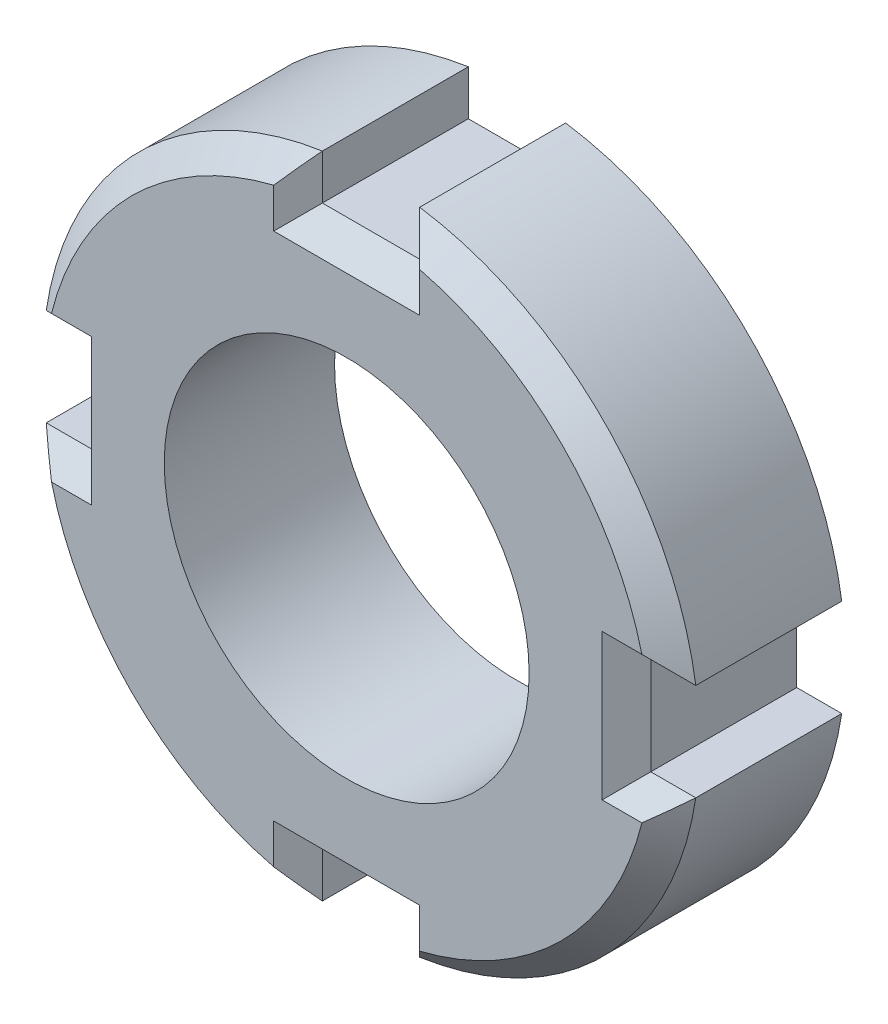
ISO-10303-21;
HEADER;
FILE_DESCRIPTION(('STEP AP214'),'2;1');
FILE_NAME('part.step','',(''),(''),'','','');
FILE_SCHEMA(('AUTOMOTIVE_DESIGN { 1 0 10303 214 1 1 1 1 }'));
ENDSEC;
DATA;
#1=APPLICATION_CONTEXT('core data for automotive mechanical design processes');
#2=APPLICATION_PROTOCOL_DEFINITION('international standard','automotive_design',2000,#1);
#3=PRODUCT_CONTEXT('',#1,'mechanical');
#4=PRODUCT('Part','Part','',(#3));
#5=PRODUCT_RELATED_PRODUCT_CATEGORY('part','',(#4));
#6=PRODUCT_DEFINITION_FORMATION('','',#4);
#7=PRODUCT_DEFINITION_CONTEXT('part definition',#1,'design');
#8=PRODUCT_DEFINITION('design','',#6,#7);
#9=PRODUCT_DEFINITION_SHAPE('','',#8);
#10=(LENGTH_UNIT() NAMED_UNIT(*) SI_UNIT(.MILLI.,.METRE.));
#11=(NAMED_UNIT(*) PLANE_ANGLE_UNIT() SI_UNIT($,.RADIAN.));
#12=(NAMED_UNIT(*) SI_UNIT($,.STERADIAN.) SOLID_ANGLE_UNIT());
#13=UNCERTAINTY_MEASURE_WITH_UNIT(LENGTH_MEASURE(1.E-05),#10,'distance_accuracy_value','');
#14=(GEOMETRIC_REPRESENTATION_CONTEXT(3) GLOBAL_UNCERTAINTY_ASSIGNED_CONTEXT((#13)) GLOBAL_UNIT_ASSIGNED_CONTEXT((#10,
#11,#12)) REPRESENTATION_CONTEXT('',''));
#15=CARTESIAN_POINT('',(0.,0.,0.));
#16=DIRECTION('',(0.,0.,1.));
#17=DIRECTION('',(1.,0.,0.));
#18=AXIS2_PLACEMENT_3D('',#15,#16,#17);
#19=CARTESIAN_POINT('',(0.,2.,7.));
#20=DIRECTION('',(0.,1.,0.));
#21=DIRECTION('',(-1.,0.,0.));
#22=AXIS2_PLACEMENT_3D('',#19,#20,#21);
#23=PLANE('',#22);
#24=DIRECTION('',(0.,0.,-1.));
#25=VECTOR('',#24,1.);
#26=CARTESIAN_POINT('',(13.3510299228187,1.99999999999995,7.));
#27=LINE('',#26,#25);
#28=CARTESIAN_POINT('',(13.3510299228187,1.99999999999995,6.));
#29=VERTEX_POINT('',#28);
#30=CARTESIAN_POINT('',(13.3510299228187,1.99999999999995,0.));
#31=VERTEX_POINT('',#30);
#32=EDGE_CURVE('E202',#29,#31,#27,.T.);
#33=ORIENTED_EDGE('',*,*,#32,.F.);
#34=DIRECTION('',(-1.,0.,0.));
#35=VECTOR('',#34,1.);
#36=CARTESIAN_POINT('',(11.5,1.99999999999996,6.));
#37=LINE('',#36,#35);
#38=CARTESIAN_POINT('',(11.5,1.99999999999996,6.));
#39=VERTEX_POINT('',#38);
#40=EDGE_CURVE('E11',#29,#39,#37,.T.);
#41=ORIENTED_EDGE('',*,*,#40,.T.);
#42=DIRECTION('',(0.,0.,-1.));
#43=VECTOR('',#42,1.);
#44=CARTESIAN_POINT('',(11.5,1.99999999999996,7.));
#45=LINE('',#44,#43);
#46=CARTESIAN_POINT('',(11.5,1.99999999999996,0.));
#47=VERTEX_POINT('',#46);
#48=EDGE_CURVE('E226',#39,#47,#45,.T.);
#49=ORIENTED_EDGE('',*,*,#48,.T.);
#50=DIRECTION('',(1.,0.,0.));
#51=VECTOR('',#50,1.);
#52=CARTESIAN_POINT('',(0.,2.,0.));
#53=LINE('',#52,#51);
#54=EDGE_CURVE('E217',#47,#31,#53,.T.);
#55=ORIENTED_EDGE('',*,*,#54,.T.);
#56=EDGE_LOOP('',(#33,#41,#49,#55));
#57=FACE_BOUND('',#56,.T.);
#58=ADVANCED_FACE('F41',(#57),#23,.F.);
#59=CARTESIAN_POINT('',(0.,0.,7.));
#60=DIRECTION('',(0.,0.,-1.));
#61=DIRECTION('',(-1.,0.,0.));
#62=AXIS2_PLACEMENT_3D('',#59,#60,#61);
#63=CYLINDRICAL_SURFACE('',#62,13.5);
#64=DIRECTION('',(0.,0.,-1.));
#65=VECTOR('',#64,1.);
#66=CARTESIAN_POINT('',(2.,13.3510299228187,7.));
#67=LINE('',#66,#65);
#68=CARTESIAN_POINT('',(2.,13.3510299228187,6.));
#69=VERTEX_POINT('',#68);
#70=CARTESIAN_POINT('',(2.,13.3510299228187,0.));
#71=VERTEX_POINT('',#70);
#72=EDGE_CURVE('E211',#69,#71,#67,.T.);
#73=ORIENTED_EDGE('',*,*,#72,.F.);
#74=CARTESIAN_POINT('',(0.,0.,6.));
#75=DIRECTION('',(0.,0.,1.));
#76=DIRECTION('',(1.,0.,0.));
#77=AXIS2_PLACEMENT_3D('',#74,#75,#76);
#78=CIRCLE('',#77,13.5);
#79=EDGE_CURVE('E51',#69,#29,#78,.F.);
#80=ORIENTED_EDGE('',*,*,#79,.T.);
#81=ORIENTED_EDGE('',*,*,#32,.T.);
#82=CARTESIAN_POINT('',(0.,0.,0.));
#83=DIRECTION('',(0.,0.,1.));
#84=DIRECTION('',(1.,0.,0.));
#85=AXIS2_PLACEMENT_3D('',#82,#83,#84);
#86=CIRCLE('',#85,13.5);
#87=EDGE_CURVE('E205',#31,#71,#86,.T.);
#88=ORIENTED_EDGE('',*,*,#87,.T.);
#89=EDGE_LOOP('',(#73,#80,#81,#88));
#90=FACE_BOUND('',#89,.T.);
#91=ADVANCED_FACE('F204',(#90),#63,.T.);
#92=CARTESIAN_POINT('',(2.,0.,7.));
#93=DIRECTION('',(-1.,0.,0.));
#94=DIRECTION('',(0.,0.,1.));
#95=AXIS2_PLACEMENT_3D('',#92,#93,#94);
#96=PLANE('',#95);
#97=DIRECTION('',(0.,0.,-1.));
#98=VECTOR('',#97,1.);
#99=CARTESIAN_POINT('',(2.,11.5,7.));
#100=LINE('',#99,#98);
#101=CARTESIAN_POINT('',(2.,11.5,6.));
#102=VERTEX_POINT('',#101);
#103=CARTESIAN_POINT('',(2.,11.5,0.));
#104=VERTEX_POINT('',#103);
#105=EDGE_CURVE('E289',#102,#104,#100,.T.);
#106=ORIENTED_EDGE('',*,*,#105,.F.);
#107=DIRECTION('',(0.,1.,0.));
#108=VECTOR('',#107,1.);
#109=CARTESIAN_POINT('',(2.,0.,6.));
#110=LINE('',#109,#108);
#111=EDGE_CURVE('E66',#102,#69,#110,.T.);
#112=ORIENTED_EDGE('',*,*,#111,.T.);
#113=ORIENTED_EDGE('',*,*,#72,.T.);
#114=DIRECTION('',(0.,1.,0.));
#115=VECTOR('',#114,1.);
#116=CARTESIAN_POINT('',(2.,0.,0.));
#117=LINE('',#116,#115);
#118=EDGE_CURVE('E221',#104,#71,#117,.T.);
#119=ORIENTED_EDGE('',*,*,#118,.F.);
#120=EDGE_LOOP('',(#106,#112,#113,#119));
#121=FACE_BOUND('',#120,.T.);
#122=ADVANCED_FACE('F512',(#121),#96,.T.);
#123=CARTESIAN_POINT('',(0.,11.5,7.));
#124=DIRECTION('',(0.,1.,0.));
#125=DIRECTION('',(0.,0.,1.));
#126=AXIS2_PLACEMENT_3D('',#123,#124,#125);
#127=PLANE('',#126);
#128=DIRECTION('',(0.,0.,-1.));
#129=VECTOR('',#128,1.);
#130=CARTESIAN_POINT('',(-2.,11.5,7.));
#131=LINE('',#130,#129);
#132=CARTESIAN_POINT('',(-2.,11.5,6.));
#133=VERTEX_POINT('',#132);
#134=CARTESIAN_POINT('',(-2.,11.5,0.));
#135=VERTEX_POINT('',#134);
#136=EDGE_CURVE('E287',#133,#135,#131,.T.);
#137=ORIENTED_EDGE('',*,*,#136,.F.);
#138=DIRECTION('',(1.,0.,0.));
#139=VECTOR('',#138,1.);
#140=CARTESIAN_POINT('',(0.,11.5,6.));
#141=LINE('',#140,#139);
#142=EDGE_CURVE('E349',#133,#102,#141,.T.);
#143=ORIENTED_EDGE('',*,*,#142,.T.);
#144=ORIENTED_EDGE('',*,*,#105,.T.);
#145=DIRECTION('',(1.,0.,0.));
#146=VECTOR('',#145,1.);
#147=CARTESIAN_POINT('',(0.,11.5,0.));
#148=LINE('',#147,#146);
#149=EDGE_CURVE('E234',#135,#104,#148,.T.);
#150=ORIENTED_EDGE('',*,*,#149,.F.);
#151=EDGE_LOOP('',(#137,#143,#144,#150));
#152=FACE_BOUND('',#151,.T.);
#153=ADVANCED_FACE('F589',(#152),#127,.T.);
#154=CARTESIAN_POINT('',(-2.,0.,7.));
#155=DIRECTION('',(-1.,0.,0.));
#156=DIRECTION('',(0.,0.,1.));
#157=AXIS2_PLACEMENT_3D('',#154,#155,#156);
#158=PLANE('',#157);
#159=DIRECTION('',(0.,0.,-1.));
#160=VECTOR('',#159,1.);
#161=CARTESIAN_POINT('',(-2.,13.3510299228187,7.));
#162=LINE('',#161,#160);
#163=CARTESIAN_POINT('',(-2.,13.3510299228187,6.));
#164=VERTEX_POINT('',#163);
#165=CARTESIAN_POINT('',(-2.,13.3510299228187,0.));
#166=VERTEX_POINT('',#165);
#167=EDGE_CURVE('E285',#164,#166,#162,.T.);
#168=ORIENTED_EDGE('',*,*,#167,.F.);
#169=DIRECTION('',(0.,-1.,0.));
#170=VECTOR('',#169,1.);
#171=CARTESIAN_POINT('',(-2.,11.5,6.));
#172=LINE('',#171,#170);
#173=EDGE_CURVE('E347',#164,#133,#172,.T.);
#174=ORIENTED_EDGE('',*,*,#173,.T.);
#175=ORIENTED_EDGE('',*,*,#136,.T.);
#176=DIRECTION('',(0.,1.,0.));
#177=VECTOR('',#176,1.);
#178=CARTESIAN_POINT('',(-2.,0.,0.));
#179=LINE('',#178,#177);
#180=EDGE_CURVE('E236',#135,#166,#179,.T.);
#181=ORIENTED_EDGE('',*,*,#180,.T.);
#182=EDGE_LOOP('',(#168,#174,#175,#181));
#183=FACE_BOUND('',#182,.T.);
#184=ADVANCED_FACE('F585',(#183),#158,.F.);
#185=DIRECTION('',(0.,0.,-1.));
#186=VECTOR('',#185,1.);
#187=CARTESIAN_POINT('',(-13.3510299228187,2.00000000000014,7.));
#188=LINE('',#187,#186);
#189=CARTESIAN_POINT('',(-13.3510299228187,2.00000000000014,6.));
#190=VERTEX_POINT('',#189);
#191=CARTESIAN_POINT('',(-13.3510299228187,2.00000000000014,0.));
#192=VERTEX_POINT('',#191);
#193=EDGE_CURVE('E283',#190,#192,#188,.T.);
#194=ORIENTED_EDGE('',*,*,#193,.F.);
#195=CARTESIAN_POINT('',(0.,0.,6.));
#196=DIRECTION('',(0.,0.,1.));
#197=DIRECTION('',(1.,0.,0.));
#198=AXIS2_PLACEMENT_3D('',#195,#196,#197);
#199=CIRCLE('',#198,13.5);
#200=EDGE_CURVE('E345',#190,#164,#199,.F.);
#201=ORIENTED_EDGE('',*,*,#200,.T.);
#202=ORIENTED_EDGE('',*,*,#167,.T.);
#203=EDGE_CURVE('E224',#166,#192,#86,.T.);
#204=ORIENTED_EDGE('',*,*,#203,.T.);
#205=EDGE_LOOP('',(#194,#201,#202,#204));
#206=FACE_BOUND('',#205,.T.);
#207=ADVANCED_FACE('F514',(#206),#63,.T.);
#208=CARTESIAN_POINT('',(0.,2.,7.));
#209=DIRECTION('',(0.,-1.,0.));
#210=DIRECTION('',(1.,0.,0.));
#211=AXIS2_PLACEMENT_3D('',#208,#209,#210);
#212=PLANE('',#211);
#213=DIRECTION('',(0.,0.,-1.));
#214=VECTOR('',#213,1.);
#215=CARTESIAN_POINT('',(-11.5,2.00000000000012,7.));
#216=LINE('',#215,#214);
#217=CARTESIAN_POINT('',(-11.5,2.00000000000012,6.));
#218=VERTEX_POINT('',#217);
#219=CARTESIAN_POINT('',(-11.5,2.00000000000012,0.));
#220=VERTEX_POINT('',#219);
#221=EDGE_CURVE('E281',#218,#220,#216,.T.);
#222=ORIENTED_EDGE('',*,*,#221,.F.);
#223=DIRECTION('',(-1.,0.,0.));
#224=VECTOR('',#223,1.);
#225=CARTESIAN_POINT('',(0.,2.,6.));
#226=LINE('',#225,#224);
#227=EDGE_CURVE('E343',#218,#190,#226,.T.);
#228=ORIENTED_EDGE('',*,*,#227,.T.);
#229=ORIENTED_EDGE('',*,*,#193,.T.);
#230=DIRECTION('',(-1.,0.,0.));
#231=VECTOR('',#230,1.);
#232=CARTESIAN_POINT('',(0.,2.,0.));
#233=LINE('',#232,#231);
#234=EDGE_CURVE('E239',#220,#192,#233,.T.);
#235=ORIENTED_EDGE('',*,*,#234,.F.);
#236=EDGE_LOOP('',(#222,#228,#229,#235));
#237=FACE_BOUND('',#236,.T.);
#238=ADVANCED_FACE('F572',(#237),#212,.T.);
#239=CARTESIAN_POINT('',(-11.5,1.196959198424E-13,7.));
#240=DIRECTION('',(-1.,0.,0.));
#241=DIRECTION('',(0.,-1.,0.));
#242=AXIS2_PLACEMENT_3D('',#239,#240,#241);
#243=PLANE('',#242);
#244=DIRECTION('',(0.,0.,-1.));
#245=VECTOR('',#244,1.);
#246=CARTESIAN_POINT('',(-11.5,-1.99999999999988,7.));
#247=LINE('',#246,#245);
#248=CARTESIAN_POINT('',(-11.5,-1.99999999999988,6.));
#249=VERTEX_POINT('',#248);
#250=CARTESIAN_POINT('',(-11.5,-1.99999999999988,0.));
#251=VERTEX_POINT('',#250);
#252=EDGE_CURVE('E279',#249,#251,#247,.T.);
#253=ORIENTED_EDGE('',*,*,#252,.F.);
#254=DIRECTION('',(0.,1.,0.));
#255=VECTOR('',#254,1.);
#256=CARTESIAN_POINT('',(-11.5,1.196959198424E-13,6.));
#257=LINE('',#256,#255);
#258=EDGE_CURVE('E341',#249,#218,#257,.T.);
#259=ORIENTED_EDGE('',*,*,#258,.T.);
#260=ORIENTED_EDGE('',*,*,#221,.T.);
#261=DIRECTION('',(0.,1.,0.));
#262=VECTOR('',#261,1.);
#263=CARTESIAN_POINT('',(-11.5,1.196959198424E-13,0.));
#264=LINE('',#263,#262);
#265=EDGE_CURVE('E242',#251,#220,#264,.T.);
#266=ORIENTED_EDGE('',*,*,#265,.F.);
#267=EDGE_LOOP('',(#253,#259,#260,#266));
#268=FACE_BOUND('',#267,.T.);
#269=ADVANCED_FACE('F644',(#268),#243,.T.);
#270=CARTESIAN_POINT('',(0.,-2.,7.));
#271=DIRECTION('',(0.,-1.,0.));
#272=DIRECTION('',(1.,0.,0.));
#273=AXIS2_PLACEMENT_3D('',#270,#271,#272);
#274=PLANE('',#273);
#275=DIRECTION('',(0.,0.,-1.));
#276=VECTOR('',#275,1.);
#277=CARTESIAN_POINT('',(-13.3510299228187,-1.99999999999986,7.));
#278=LINE('',#277,#276);
#279=CARTESIAN_POINT('',(-13.3510299228187,-1.99999999999986,6.));
#280=VERTEX_POINT('',#279);
#281=CARTESIAN_POINT('',(-13.3510299228187,-1.99999999999986,0.));
#282=VERTEX_POINT('',#281);
#283=EDGE_CURVE('E277',#280,#282,#278,.T.);
#284=ORIENTED_EDGE('',*,*,#283,.F.);
#285=DIRECTION('',(1.,0.,0.));
#286=VECTOR('',#285,1.);
#287=CARTESIAN_POINT('',(-11.5,-1.99999999999988,6.));
#288=LINE('',#287,#286);
#289=EDGE_CURVE('E339',#280,#249,#288,.T.);
#290=ORIENTED_EDGE('',*,*,#289,.T.);
#291=ORIENTED_EDGE('',*,*,#252,.T.);
#292=DIRECTION('',(-1.,0.,0.));
#293=VECTOR('',#292,1.);
#294=CARTESIAN_POINT('',(0.,-2.,0.));
#295=LINE('',#294,#293);
#296=EDGE_CURVE('E245',#251,#282,#295,.T.);
#297=ORIENTED_EDGE('',*,*,#296,.T.);
#298=EDGE_LOOP('',(#284,#290,#291,#297));
#299=FACE_BOUND('',#298,.T.);
#300=ADVANCED_FACE('F636',(#299),#274,.F.);
#301=DIRECTION('',(0.,0.,-1.));
#302=VECTOR('',#301,1.);
#303=CARTESIAN_POINT('',(-2.00000000000009,-13.3510299228187,7.));
#304=LINE('',#303,#302);
#305=CARTESIAN_POINT('',(-2.00000000000009,-13.3510299228187,6.));
#306=VERTEX_POINT('',#305);
#307=CARTESIAN_POINT('',(-2.00000000000009,-13.3510299228187,0.));
#308=VERTEX_POINT('',#307);
#309=EDGE_CURVE('E275',#306,#308,#304,.T.);
#310=ORIENTED_EDGE('',*,*,#309,.F.);
#311=CARTESIAN_POINT('',(0.,0.,6.));
#312=DIRECTION('',(0.,0.,1.));
#313=DIRECTION('',(1.,0.,0.));
#314=AXIS2_PLACEMENT_3D('',#311,#312,#313);
#315=CIRCLE('',#314,13.5);
#316=EDGE_CURVE('E337',#306,#280,#315,.F.);
#317=ORIENTED_EDGE('',*,*,#316,.T.);
#318=ORIENTED_EDGE('',*,*,#283,.T.);
#319=EDGE_CURVE('E248',#282,#308,#86,.T.);
#320=ORIENTED_EDGE('',*,*,#319,.T.);
#321=EDGE_LOOP('',(#310,#317,#318,#320));
#322=FACE_BOUND('',#321,.T.);
#323=ADVANCED_FACE('F633',(#322),#63,.T.);
#324=CARTESIAN_POINT('',(-2.,0.,7.));
#325=DIRECTION('',(1.,0.,0.));
#326=DIRECTION('',(0.,1.,0.));
#327=AXIS2_PLACEMENT_3D('',#324,#325,#326);
#328=PLANE('',#327);
#329=DIRECTION('',(0.,0.,-1.));
#330=VECTOR('',#329,1.);
#331=CARTESIAN_POINT('',(-2.00000000000008,-11.5,7.));
#332=LINE('',#331,#330);
#333=CARTESIAN_POINT('',(-2.00000000000008,-11.5,6.));
#334=VERTEX_POINT('',#333);
#335=CARTESIAN_POINT('',(-2.00000000000008,-11.5,0.));
#336=VERTEX_POINT('',#335);
#337=EDGE_CURVE('E273',#334,#336,#332,.T.);
#338=ORIENTED_EDGE('',*,*,#337,.F.);
#339=DIRECTION('',(0.,-1.,0.));
#340=VECTOR('',#339,1.);
#341=CARTESIAN_POINT('',(-2.,0.,6.));
#342=LINE('',#341,#340);
#343=EDGE_CURVE('E335',#334,#306,#342,.T.);
#344=ORIENTED_EDGE('',*,*,#343,.T.);
#345=ORIENTED_EDGE('',*,*,#309,.T.);
#346=DIRECTION('',(0.,-1.,0.));
#347=VECTOR('',#346,1.);
#348=CARTESIAN_POINT('',(-2.,0.,0.));
#349=LINE('',#348,#347);
#350=EDGE_CURVE('E249',#336,#308,#349,.T.);
#351=ORIENTED_EDGE('',*,*,#350,.F.);
#352=EDGE_LOOP('',(#338,#344,#345,#351));
#353=FACE_BOUND('',#352,.T.);
#354=ADVANCED_FACE('F647',(#353),#328,.T.);
#355=CARTESIAN_POINT('',(0.,-11.5,7.));
#356=DIRECTION('',(0.,-1.,0.));
#357=DIRECTION('',(1.,0.,0.));
#358=AXIS2_PLACEMENT_3D('',#355,#356,#357);
#359=PLANE('',#358);
#360=DIRECTION('',(0.,0.,-1.));
#361=VECTOR('',#360,1.);
#362=CARTESIAN_POINT('',(1.99999999999992,-11.5,7.));
#363=LINE('',#362,#361);
#364=CARTESIAN_POINT('',(1.99999999999992,-11.5,6.));
#365=VERTEX_POINT('',#364);
#366=CARTESIAN_POINT('',(1.99999999999992,-11.5,0.));
#367=VERTEX_POINT('',#366);
#368=EDGE_CURVE('E271',#365,#367,#363,.T.);
#369=ORIENTED_EDGE('',*,*,#368,.F.);
#370=DIRECTION('',(-1.,0.,0.));
#371=VECTOR('',#370,1.);
#372=CARTESIAN_POINT('',(0.,-11.5,6.));
#373=LINE('',#372,#371);
#374=EDGE_CURVE('E333',#365,#334,#373,.T.);
#375=ORIENTED_EDGE('',*,*,#374,.T.);
#376=ORIENTED_EDGE('',*,*,#337,.T.);
#377=DIRECTION('',(-1.,0.,0.));
#378=VECTOR('',#377,1.);
#379=CARTESIAN_POINT('',(0.,-11.5,0.));
#380=LINE('',#379,#378);
#381=EDGE_CURVE('E252',#367,#336,#380,.T.);
#382=ORIENTED_EDGE('',*,*,#381,.F.);
#383=EDGE_LOOP('',(#369,#375,#376,#382));
#384=FACE_BOUND('',#383,.T.);
#385=ADVANCED_FACE('F611',(#384),#359,.T.);
#386=CARTESIAN_POINT('',(2.,0.,7.));
#387=DIRECTION('',(1.,0.,0.));
#388=DIRECTION('',(0.,1.,0.));
#389=AXIS2_PLACEMENT_3D('',#386,#387,#388);
#390=PLANE('',#389);
#391=DIRECTION('',(0.,0.,-1.));
#392=VECTOR('',#391,1.);
#393=CARTESIAN_POINT('',(1.99999999999991,-13.3510299228187,7.));
#394=LINE('',#393,#392);
#395=CARTESIAN_POINT('',(1.99999999999991,-13.3510299228187,6.));
#396=VERTEX_POINT('',#395);
#397=CARTESIAN_POINT('',(1.99999999999991,-13.3510299228187,0.));
#398=VERTEX_POINT('',#397);
#399=EDGE_CURVE('E269',#396,#398,#394,.T.);
#400=ORIENTED_EDGE('',*,*,#399,.F.);
#401=DIRECTION('',(0.,1.,0.));
#402=VECTOR('',#401,1.);
#403=CARTESIAN_POINT('',(1.99999999999992,-11.5,6.));
#404=LINE('',#403,#402);
#405=EDGE_CURVE('E331',#396,#365,#404,.T.);
#406=ORIENTED_EDGE('',*,*,#405,.T.);
#407=ORIENTED_EDGE('',*,*,#368,.T.);
#408=DIRECTION('',(0.,-1.,0.));
#409=VECTOR('',#408,1.);
#410=CARTESIAN_POINT('',(2.,0.,0.));
#411=LINE('',#410,#409);
#412=EDGE_CURVE('E255',#367,#398,#411,.T.);
#413=ORIENTED_EDGE('',*,*,#412,.T.);
#414=EDGE_LOOP('',(#400,#406,#407,#413));
#415=FACE_BOUND('',#414,.T.);
#416=ADVANCED_FACE('F608',(#415),#390,.F.);
#417=DIRECTION('',(0.,0.,-1.));
#418=VECTOR('',#417,1.);
#419=CARTESIAN_POINT('',(13.3510299228187,-2.00000000000005,7.));
#420=LINE('',#419,#418);
#421=CARTESIAN_POINT('',(13.3510299228187,-2.00000000000005,6.));
#422=VERTEX_POINT('',#421);
#423=CARTESIAN_POINT('',(13.3510299228187,-2.00000000000005,0.));
#424=VERTEX_POINT('',#423);
#425=EDGE_CURVE('E267',#422,#424,#420,.T.);
#426=ORIENTED_EDGE('',*,*,#425,.F.);
#427=CARTESIAN_POINT('',(0.,0.,6.));
#428=DIRECTION('',(0.,0.,1.));
#429=DIRECTION('',(1.,0.,0.));
#430=AXIS2_PLACEMENT_3D('',#427,#428,#429);
#431=CIRCLE('',#430,13.5);
#432=EDGE_CURVE('E329',#422,#396,#431,.F.);
#433=ORIENTED_EDGE('',*,*,#432,.T.);
#434=ORIENTED_EDGE('',*,*,#399,.T.);
#435=EDGE_CURVE('E223',#398,#424,#86,.T.);
#436=ORIENTED_EDGE('',*,*,#435,.T.);
#437=EDGE_LOOP('',(#426,#433,#434,#436));
#438=FACE_BOUND('',#437,.T.);
#439=ADVANCED_FACE('F515',(#438),#63,.T.);
#440=CARTESIAN_POINT('',(0.,-2.,7.));
#441=DIRECTION('',(0.,1.,0.));
#442=DIRECTION('',(-1.,0.,0.));
#443=AXIS2_PLACEMENT_3D('',#440,#441,#442);
#444=PLANE('',#443);
#445=DIRECTION('',(0.,0.,-1.));
#446=VECTOR('',#445,1.);
#447=CARTESIAN_POINT('',(11.5,-2.00000000000004,7.));
#448=LINE('',#447,#446);
#449=CARTESIAN_POINT('',(11.5,-2.00000000000004,6.));
#450=VERTEX_POINT('',#449);
#451=CARTESIAN_POINT('',(11.5,-2.00000000000004,0.));
#452=VERTEX_POINT('',#451);
#453=EDGE_CURVE('E265',#450,#452,#448,.T.);
#454=ORIENTED_EDGE('',*,*,#453,.F.);
#455=DIRECTION('',(1.,0.,0.));
#456=VECTOR('',#455,1.);
#457=CARTESIAN_POINT('',(0.,-2.,6.));
#458=LINE('',#457,#456);
#459=EDGE_CURVE('E327',#450,#422,#458,.T.);
#460=ORIENTED_EDGE('',*,*,#459,.T.);
#461=ORIENTED_EDGE('',*,*,#425,.T.);
#462=DIRECTION('',(1.,0.,0.));
#463=VECTOR('',#462,1.);
#464=CARTESIAN_POINT('',(0.,-2.,0.));
#465=LINE('',#464,#463);
#466=EDGE_CURVE('E258',#452,#424,#465,.T.);
#467=ORIENTED_EDGE('',*,*,#466,.F.);
#468=EDGE_LOOP('',(#454,#460,#461,#467));
#469=FACE_BOUND('',#468,.T.);
#470=ADVANCED_FACE('F522',(#469),#444,.T.);
#471=CARTESIAN_POINT('',(0.,0.,7.));
#472=DIRECTION('',(0.,0.,-1.));
#473=DIRECTION('',(-1.,0.,0.));
#474=AXIS2_PLACEMENT_3D('',#471,#472,#473);
#475=CYLINDRICAL_SURFACE('',#474,7.5);
#476=CARTESIAN_POINT('',(0.,0.,7.));
#477=DIRECTION('',(0.,0.,1.));
#478=DIRECTION('',(1.,0.,0.));
#479=AXIS2_PLACEMENT_3D('',#476,#477,#478);
#480=CIRCLE('',#479,7.5);
#481=CARTESIAN_POINT('',(7.5,0.,7.));
#482=VERTEX_POINT('',#481);
#483=EDGE_CURVE('E263',#482,#482,#480,.T.);
#484=ORIENTED_EDGE('',*,*,#483,.T.);
#485=EDGE_LOOP('',(#484));
#486=FACE_BOUND('',#485,.T.);
#487=CARTESIAN_POINT('',(0.,0.,0.));
#488=DIRECTION('',(0.,0.,1.));
#489=DIRECTION('',(1.,0.,0.));
#490=AXIS2_PLACEMENT_3D('',#487,#488,#489);
#491=CIRCLE('',#490,7.5);
#492=CARTESIAN_POINT('',(7.5,0.,0.));
#493=VERTEX_POINT('',#492);
#494=EDGE_CURVE('E227',#493,#493,#491,.T.);
#495=ORIENTED_EDGE('',*,*,#494,.F.);
#496=EDGE_LOOP('',(#495));
#497=FACE_BOUND('',#496,.T.);
#498=ADVANCED_FACE('F519',(#486,#497),#475,.F.);
#499=CARTESIAN_POINT('',(11.5,0.,7.));
#500=DIRECTION('',(1.,0.,0.));
#501=DIRECTION('',(0.,1.,0.));
#502=AXIS2_PLACEMENT_3D('',#499,#500,#501);
#503=PLANE('',#502);
#504=ORIENTED_EDGE('',*,*,#48,.F.);
#505=DIRECTION('',(0.,-1.,0.));
#506=VECTOR('',#505,1.);
#507=CARTESIAN_POINT('',(11.5,0.,6.));
#508=LINE('',#507,#506);
#509=EDGE_CURVE('E210',#39,#450,#508,.T.);
#510=ORIENTED_EDGE('',*,*,#509,.T.);
#511=ORIENTED_EDGE('',*,*,#453,.T.);
#512=DIRECTION('',(0.,-1.,0.));
#513=VECTOR('',#512,1.);
#514=CARTESIAN_POINT('',(11.5,0.,0.));
#515=LINE('',#514,#513);
#516=EDGE_CURVE('E261',#47,#452,#515,.T.);
#517=ORIENTED_EDGE('',*,*,#516,.F.);
#518=EDGE_LOOP('',(#504,#510,#511,#517));
#519=FACE_BOUND('',#518,.T.);
#520=ADVANCED_FACE('F521',(#519),#503,.T.);
#521=CARTESIAN_POINT('',(0.,0.,7.));
#522=DIRECTION('',(0.,0.,1.));
#523=DIRECTION('',(1.,0.,0.));
#524=AXIS2_PLACEMENT_3D('',#521,#522,#523);
#525=PLANE('',#524);
#526=DIRECTION('',(-1.,0.,0.));
#527=VECTOR('',#526,1.);
#528=CARTESIAN_POINT('',(0.,-3.,7.));
#529=LINE('',#528,#527);
#530=CARTESIAN_POINT('',(12.1346610995116,-3.00000000000004,7.));
#531=VERTEX_POINT('',#530);
#532=CARTESIAN_POINT('',(10.5,-3.00000000000004,7.));
#533=VERTEX_POINT('',#532);
#534=EDGE_CURVE('E322',#531,#533,#529,.T.);
#535=ORIENTED_EDGE('',*,*,#534,.T.);
#536=DIRECTION('',(0.,1.,0.));
#537=VECTOR('',#536,1.);
#538=CARTESIAN_POINT('',(10.5,0.,7.));
#539=LINE('',#538,#537);
#540=CARTESIAN_POINT('',(10.5,2.99999999999996,7.));
#541=VERTEX_POINT('',#540);
#542=EDGE_CURVE('E324',#533,#541,#539,.T.);
#543=ORIENTED_EDGE('',*,*,#542,.T.);
#544=DIRECTION('',(1.,0.,0.));
#545=VECTOR('',#544,1.);
#546=CARTESIAN_POINT('',(13.3510299228187,2.99999999999995,7.));
#547=LINE('',#546,#545);
#548=CARTESIAN_POINT('',(12.1346610995116,2.99999999999996,7.));
#549=VERTEX_POINT('',#548);
#550=EDGE_CURVE('E294',#541,#549,#547,.T.);
#551=ORIENTED_EDGE('',*,*,#550,.T.);
#552=CARTESIAN_POINT('',(0.,0.,7.));
#553=DIRECTION('',(0.,0.,1.));
#554=DIRECTION('',(1.,0.,0.));
#555=AXIS2_PLACEMENT_3D('',#552,#553,#554);
#556=CIRCLE('',#555,12.5);
#557=CARTESIAN_POINT('',(3.,12.1346610995116,7.));
#558=VERTEX_POINT('',#557);
#559=EDGE_CURVE('E296',#549,#558,#556,.T.);
#560=ORIENTED_EDGE('',*,*,#559,.T.);
#561=DIRECTION('',(0.,-1.,0.));
#562=VECTOR('',#561,1.);
#563=CARTESIAN_POINT('',(3.,0.,7.));
#564=LINE('',#563,#562);
#565=CARTESIAN_POINT('',(3.,10.5,7.));
#566=VERTEX_POINT('',#565);
#567=EDGE_CURVE('E298',#558,#566,#564,.T.);
#568=ORIENTED_EDGE('',*,*,#567,.T.);
#569=DIRECTION('',(-1.,0.,0.));
#570=VECTOR('',#569,1.);
#571=CARTESIAN_POINT('',(0.,10.5,7.));
#572=LINE('',#571,#570);
#573=CARTESIAN_POINT('',(-3.,10.5,7.));
#574=VERTEX_POINT('',#573);
#575=EDGE_CURVE('E300',#566,#574,#572,.T.);
#576=ORIENTED_EDGE('',*,*,#575,.T.);
#577=DIRECTION('',(0.,1.,0.));
#578=VECTOR('',#577,1.);
#579=CARTESIAN_POINT('',(-3.,13.3510299228187,7.));
#580=LINE('',#579,#578);
#581=CARTESIAN_POINT('',(-3.,12.1346610995116,7.));
#582=VERTEX_POINT('',#581);
#583=EDGE_CURVE('E302',#574,#582,#580,.T.);
#584=ORIENTED_EDGE('',*,*,#583,.T.);
#585=CARTESIAN_POINT('',(0.,0.,7.));
#586=DIRECTION('',(0.,0.,1.));
#587=DIRECTION('',(1.,0.,0.));
#588=AXIS2_PLACEMENT_3D('',#585,#586,#587);
#589=CIRCLE('',#588,12.5);
#590=CARTESIAN_POINT('',(-12.1346610995116,3.00000000000013,7.));
#591=VERTEX_POINT('',#590);
#592=EDGE_CURVE('E304',#582,#591,#589,.T.);
#593=ORIENTED_EDGE('',*,*,#592,.T.);
#594=DIRECTION('',(1.,0.,0.));
#595=VECTOR('',#594,1.);
#596=CARTESIAN_POINT('',(0.,3.,7.));
#597=LINE('',#596,#595);
#598=CARTESIAN_POINT('',(-10.5,3.00000000000011,7.));
#599=VERTEX_POINT('',#598);
#600=EDGE_CURVE('E306',#591,#599,#597,.T.);
#601=ORIENTED_EDGE('',*,*,#600,.T.);
#602=DIRECTION('',(0.,-1.,0.));
#603=VECTOR('',#602,1.);
#604=CARTESIAN_POINT('',(-10.5,1.09287578986539E-13,7.));
#605=LINE('',#604,#603);
#606=CARTESIAN_POINT('',(-10.5,-2.99999999999989,7.));
#607=VERTEX_POINT('',#606);
#608=EDGE_CURVE('E308',#599,#607,#605,.T.);
#609=ORIENTED_EDGE('',*,*,#608,.T.);
#610=DIRECTION('',(-1.,0.,0.));
#611=VECTOR('',#610,1.);
#612=CARTESIAN_POINT('',(-13.3510299228187,-2.99999999999986,7.));
#613=LINE('',#612,#611);
#614=CARTESIAN_POINT('',(-12.1346610995116,-2.99999999999987,7.));
#615=VERTEX_POINT('',#614);
#616=EDGE_CURVE('E310',#607,#615,#613,.T.);
#617=ORIENTED_EDGE('',*,*,#616,.T.);
#618=CARTESIAN_POINT('',(0.,0.,7.));
#619=DIRECTION('',(0.,0.,1.));
#620=DIRECTION('',(1.,0.,0.));
#621=AXIS2_PLACEMENT_3D('',#618,#619,#620);
#622=CIRCLE('',#621,12.5);
#623=CARTESIAN_POINT('',(-3.00000000000009,-12.1346610995116,7.));
#624=VERTEX_POINT('',#623);
#625=EDGE_CURVE('E312',#615,#624,#622,.T.);
#626=ORIENTED_EDGE('',*,*,#625,.T.);
#627=DIRECTION('',(0.,1.,0.));
#628=VECTOR('',#627,1.);
#629=CARTESIAN_POINT('',(-3.,0.,7.));
#630=LINE('',#629,#628);
#631=CARTESIAN_POINT('',(-3.00000000000007,-10.5,7.));
#632=VERTEX_POINT('',#631);
#633=EDGE_CURVE('E314',#624,#632,#630,.T.);
#634=ORIENTED_EDGE('',*,*,#633,.T.);
#635=DIRECTION('',(1.,0.,0.));
#636=VECTOR('',#635,1.);
#637=CARTESIAN_POINT('',(0.,-10.5,7.));
#638=LINE('',#637,#636);
#639=CARTESIAN_POINT('',(2.99999999999993,-10.5,7.));
#640=VERTEX_POINT('',#639);
#641=EDGE_CURVE('E316',#632,#640,#638,.T.);
#642=ORIENTED_EDGE('',*,*,#641,.T.);
#643=DIRECTION('',(0.,-1.,0.));
#644=VECTOR('',#643,1.);
#645=CARTESIAN_POINT('',(2.99999999999991,-13.3510299228187,7.));
#646=LINE('',#645,#644);
#647=CARTESIAN_POINT('',(2.99999999999992,-12.1346610995116,7.));
#648=VERTEX_POINT('',#647);
#649=EDGE_CURVE('E318',#640,#648,#646,.T.);
#650=ORIENTED_EDGE('',*,*,#649,.T.);
#651=CARTESIAN_POINT('',(0.,0.,7.));
#652=DIRECTION('',(0.,0.,1.));
#653=DIRECTION('',(1.,0.,0.));
#654=AXIS2_PLACEMENT_3D('',#651,#652,#653);
#655=CIRCLE('',#654,12.5);
#656=EDGE_CURVE('E320',#648,#531,#655,.T.);
#657=ORIENTED_EDGE('',*,*,#656,.T.);
#658=EDGE_LOOP('',(#535,#543,#551,#560,#568,#576,#584,#593,#601,#609,#617,#626,#634,#642,#650,#657));
#659=FACE_BOUND('',#658,.T.);
#660=ORIENTED_EDGE('',*,*,#483,.F.);
#661=EDGE_LOOP('',(#660));
#662=FACE_BOUND('',#661,.T.);
#663=ADVANCED_FACE('F540',(#659,#662),#525,.T.);
#664=CARTESIAN_POINT('',(0.,0.,0.));
#665=DIRECTION('',(0.,0.,1.));
#666=DIRECTION('',(1.,0.,0.));
#667=AXIS2_PLACEMENT_3D('',#664,#665,#666);
#668=PLANE('',#667);
#669=ORIENTED_EDGE('',*,*,#494,.T.);
#670=EDGE_LOOP('',(#669));
#671=FACE_BOUND('',#670,.T.);
#672=ORIENTED_EDGE('',*,*,#54,.F.);
#673=ORIENTED_EDGE('',*,*,#516,.T.);
#674=ORIENTED_EDGE('',*,*,#466,.T.);
#675=ORIENTED_EDGE('',*,*,#435,.F.);
#676=ORIENTED_EDGE('',*,*,#412,.F.);
#677=ORIENTED_EDGE('',*,*,#381,.T.);
#678=ORIENTED_EDGE('',*,*,#350,.T.);
#679=ORIENTED_EDGE('',*,*,#319,.F.);
#680=ORIENTED_EDGE('',*,*,#296,.F.);
#681=ORIENTED_EDGE('',*,*,#265,.T.);
#682=ORIENTED_EDGE('',*,*,#234,.T.);
#683=ORIENTED_EDGE('',*,*,#203,.F.);
#684=ORIENTED_EDGE('',*,*,#180,.F.);
#685=ORIENTED_EDGE('',*,*,#149,.T.);
#686=ORIENTED_EDGE('',*,*,#118,.T.);
#687=ORIENTED_EDGE('',*,*,#87,.F.);
#688=EDGE_LOOP('',(#672,#673,#674,#675,#676,#677,#678,#679,#680,#681,#682,#683,#684,#685,#686,#687));
#689=FACE_BOUND('',#688,.T.);
#690=ADVANCED_FACE('F215',(#671,#689),#668,.F.);
#691=CARTESIAN_POINT('',(-11.5,1.196959198424E-13,6.));
#692=DIRECTION('',(0.707106781186549,0.,-0.707106781186546));
#693=DIRECTION('',(0.,1.,0.));
#694=AXIS2_PLACEMENT_3D('',#691,#692,#693);
#695=PLANE('',#694);
#696=DIRECTION('',(-0.577350269189619,0.577350269189631,-0.577350269189627));
#697=VECTOR('',#696,1.);
#698=CARTESIAN_POINT('',(-7.00000000000008,-6.49999999999992,10.5));
#699=LINE('',#698,#697);
#700=EDGE_CURVE('E580',#607,#249,#699,.T.);
#701=ORIENTED_EDGE('',*,*,#700,.F.);
#702=ORIENTED_EDGE('',*,*,#608,.F.);
#703=DIRECTION('',(0.577350269189631,0.577350269189619,0.577350269189627));
#704=VECTOR('',#703,1.);
#705=CARTESIAN_POINT('',(-12.1666666666667,1.33333333333346,5.33333333333333));
#706=LINE('',#705,#704);
#707=EDGE_CURVE('E46',#218,#599,#706,.T.);
#708=ORIENTED_EDGE('',*,*,#707,.F.);
#709=ORIENTED_EDGE('',*,*,#258,.F.);
#710=EDGE_LOOP('',(#701,#702,#708,#709));
#711=FACE_BOUND('',#710,.T.);
#712=ADVANCED_FACE('F44',(#711),#695,.F.);
#713=CARTESIAN_POINT('',(0.,2.,6.));
#714=DIRECTION('',(0.,0.707106781186549,-0.707106781186546));
#715=DIRECTION('',(-1.,0.,0.));
#716=AXIS2_PLACEMENT_3D('',#713,#714,#715);
#717=PLANE('',#716);
#718=ORIENTED_EDGE('',*,*,#707,.T.);
#719=ORIENTED_EDGE('',*,*,#600,.F.);
#720=CARTESIAN_POINT('',(-13.3510299228187,2.00000000000014,6.));
#721=CARTESIAN_POINT('',(-13.2523828477892,2.0849696165379,6.08496961653776));
#722=CARTESIAN_POINT('',(-13.1530830854174,2.1695611156154,6.16956111561526));
#723=CARTESIAN_POINT('',(-12.9531500646906,2.33793228302794,6.33793228302781));
#724=CARTESIAN_POINT('',(-12.8525169937917,2.42171206267821,6.42171206267807));
#725=CARTESIAN_POINT('',(-12.6498604325665,2.58842899544437,6.58842899544423));
#726=CARTESIAN_POINT('',(-12.5478369233869,2.67136613710797,6.67136613710783));
#727=CARTESIAN_POINT('',(-12.3423424005422,2.83635923750072,6.83635923750059));
#728=CARTESIAN_POINT('',(-12.2388711874161,2.91841507199701,6.91841507199688));
#729=CARTESIAN_POINT('',(-12.1346610995116,3.00000000000014,7.00000000000001));
#730=B_SPLINE_CURVE_WITH_KNOTS('',3,(#720,#721,#722,#723,#724,#725,#726,#727,#728,#729),
.UNSPECIFIED.,.F.,.F.,(4,2,2,2,4),(0.,0.466408861721675,0.932752830398952,1.39910312869872,
1.86551832499404),.UNSPECIFIED.);
#731=EDGE_CURVE('E475',#190,#591,#730,.T.);
#732=ORIENTED_EDGE('',*,*,#731,.F.);
#733=ORIENTED_EDGE('',*,*,#227,.F.);
#734=EDGE_LOOP('',(#718,#719,#732,#733));
#735=FACE_BOUND('',#734,.T.);
#736=ADVANCED_FACE('F494',(#735),#717,.F.);
#737=CARTESIAN_POINT('',(0.,-3.,7.));
#738=DIRECTION('',(0.,0.707106781186549,0.707106781186546));
#739=DIRECTION('',(1.,0.,0.));
#740=AXIS2_PLACEMENT_3D('',#737,#738,#739);
#741=PLANE('',#740);
#742=ORIENTED_EDGE('',*,*,#700,.T.);
#743=ORIENTED_EDGE('',*,*,#289,.F.);
#744=CARTESIAN_POINT('',(-13.3510299228187,-1.99999999999986,6.));
#745=CARTESIAN_POINT('',(-13.2523828477892,-2.08496961653762,6.08496961653776));
#746=CARTESIAN_POINT('',(-13.1530830854174,-2.16956111561513,6.16956111561526));
#747=CARTESIAN_POINT('',(-12.9531500646906,-2.33793228302767,6.33793228302781));
#748=CARTESIAN_POINT('',(-12.8525169937917,-2.42171206267794,6.42171206267807));
#749=CARTESIAN_POINT('',(-12.6498604325666,-2.5884289954441,6.58842899544423));
#750=CARTESIAN_POINT('',(-12.5478369233869,-2.6713661371077,6.67136613710783));
#751=CARTESIAN_POINT('',(-12.3423424005423,-2.83635923750046,6.83635923750059));
#752=CARTESIAN_POINT('',(-12.2388711874162,-2.91841507199675,6.91841507199688));
#753=CARTESIAN_POINT('',(-12.1346610995116,-2.99999999999988,7.00000000000001));
#754=B_SPLINE_CURVE_WITH_KNOTS('',3,(#744,#745,#746,#747,#748,#749,#750,#751,#752,#753),
.UNSPECIFIED.,.F.,.F.,(4,2,2,2,4),(0.,0.466408861721673,0.93275283039895,1.39910312869872,
1.86551832499404),.UNSPECIFIED.);
#755=EDGE_CURVE('E467',#615,#280,#754,.F.);
#756=ORIENTED_EDGE('',*,*,#755,.F.);
#757=ORIENTED_EDGE('',*,*,#616,.F.);
#758=EDGE_LOOP('',(#742,#743,#756,#757));
#759=FACE_BOUND('',#758,.T.);
#760=ADVANCED_FACE('F487',(#759),#741,.T.);
#761=CARTESIAN_POINT('',(0.,0.,7.));
#762=DIRECTION('',(0.,0.,-1.));
#763=DIRECTION('',(-1.,0.,0.));
#764=AXIS2_PLACEMENT_3D('',#761,#762,#763);
#765=CONICAL_SURFACE('',#764,12.5,0.785398163397447);
#766=ORIENTED_EDGE('',*,*,#731,.T.);
#767=ORIENTED_EDGE('',*,*,#592,.F.);
#768=CARTESIAN_POINT('',(-2.,13.3510299228187,6.));
#769=CARTESIAN_POINT('',(-2.08496961653776,13.2523828477892,6.08496961653776));
#770=CARTESIAN_POINT('',(-2.16956111561527,13.1530830854174,6.16956111561526));
#771=CARTESIAN_POINT('',(-2.33793228302781,12.9531500646906,6.3379322830278));
#772=CARTESIAN_POINT('',(-2.42171206267807,12.8525169937917,6.42171206267807));
#773=CARTESIAN_POINT('',(-2.58842899544423,12.6498604325665,6.58842899544423));
#774=CARTESIAN_POINT('',(-2.67136613710784,12.5478369233869,6.67136613710783));
#775=CARTESIAN_POINT('',(-2.83635923750059,12.3423424005422,6.83635923750059));
#776=CARTESIAN_POINT('',(-2.91841507199688,12.2388711874162,6.91841507199688));
#777=CARTESIAN_POINT('',(-3.00000000000001,12.1346610995116,7.00000000000001));
#778=B_SPLINE_CURVE_WITH_KNOTS('',3,(#768,#769,#770,#771,#772,#773,#774,#775,#776,#777),
.UNSPECIFIED.,.F.,.F.,(4,2,2,2,4),(0.,0.466408861721673,0.932752830398952,1.39910312869872,
1.86551832499404),.UNSPECIFIED.);
#779=EDGE_CURVE('E476',#164,#582,#778,.T.);
#780=ORIENTED_EDGE('',*,*,#779,.F.);
#781=ORIENTED_EDGE('',*,*,#200,.F.);
#782=EDGE_LOOP('',(#766,#767,#780,#781));
#783=FACE_BOUND('',#782,.T.);
#784=ADVANCED_FACE('F453',(#783),#765,.T.);
#785=CARTESIAN_POINT('',(0.,0.,7.));
#786=DIRECTION('',(0.,0.,-1.));
#787=DIRECTION('',(-1.,0.,0.));
#788=AXIS2_PLACEMENT_3D('',#785,#786,#787);
#789=CONICAL_SURFACE('',#788,12.5,0.785398163397446);
#790=ORIENTED_EDGE('',*,*,#755,.T.);
#791=ORIENTED_EDGE('',*,*,#316,.F.);
#792=CARTESIAN_POINT('',(-2.00000000000009,-13.3510299228187,6.));
#793=CARTESIAN_POINT('',(-2.08496961653785,-13.2523828477892,6.08496961653776));
#794=CARTESIAN_POINT('',(-2.16956111561536,-13.1530830854174,6.16956111561526));
#795=CARTESIAN_POINT('',(-2.3379322830279,-12.9531500646906,6.33793228302781));
#796=CARTESIAN_POINT('',(-2.42171206267816,-12.8525169937917,6.42171206267807));
#797=CARTESIAN_POINT('',(-2.58842899544432,-12.6498604325665,6.58842899544423));
#798=CARTESIAN_POINT('',(-2.67136613710792,-12.5478369233869,6.67136613710784));
#799=CARTESIAN_POINT('',(-2.83635923750068,-12.3423424005422,6.83635923750059));
#800=CARTESIAN_POINT('',(-2.91841507199696,-12.2388711874161,6.91841507199688));
#801=CARTESIAN_POINT('',(-3.0000000000001,-12.1346610995116,7.00000000000001));
#802=B_SPLINE_CURVE_WITH_KNOTS('',3,(#792,#793,#794,#795,#796,#797,#798,#799,#800,#801),
.UNSPECIFIED.,.F.,.F.,(4,2,2,2,4),(0.,0.466408861721676,0.932752830398953,1.39910312869872,
1.86551832499404),.UNSPECIFIED.);
#803=EDGE_CURVE('E459',#624,#306,#802,.F.);
#804=ORIENTED_EDGE('',*,*,#803,.F.);
#805=ORIENTED_EDGE('',*,*,#625,.F.);
#806=EDGE_LOOP('',(#790,#791,#804,#805));
#807=FACE_BOUND('',#806,.T.);
#808=ADVANCED_FACE('F445',(#807),#789,.T.);
#809=CARTESIAN_POINT('',(-3.,0.,7.));
#810=DIRECTION('',(0.707106781186549,0.,0.707106781186546));
#811=DIRECTION('',(0.,-1.,0.));
#812=AXIS2_PLACEMENT_3D('',#809,#810,#811);
#813=PLANE('',#812);
#814=ORIENTED_EDGE('',*,*,#779,.T.);
#815=ORIENTED_EDGE('',*,*,#583,.F.);
#816=DIRECTION('',(0.577350269189625,0.577350269189625,-0.577350269189627));
#817=VECTOR('',#816,1.);
#818=CARTESIAN_POINT('',(-6.49999999999999,7.00000000000001,10.5));
#819=LINE('',#818,#817);
#820=EDGE_CURVE('E620',#133,#574,#819,.F.);
#821=ORIENTED_EDGE('',*,*,#820,.F.);
#822=ORIENTED_EDGE('',*,*,#173,.F.);
#823=EDGE_LOOP('',(#814,#815,#821,#822));
#824=FACE_BOUND('',#823,.T.);
#825=ADVANCED_FACE('F452',(#824),#813,.T.);
#826=CARTESIAN_POINT('',(-2.,0.,6.));
#827=DIRECTION('',(-0.707106781186549,0.,-0.707106781186546));
#828=DIRECTION('',(0.,-1.,0.));
#829=AXIS2_PLACEMENT_3D('',#826,#827,#828);
#830=PLANE('',#829);
#831=ORIENTED_EDGE('',*,*,#803,.T.);
#832=ORIENTED_EDGE('',*,*,#343,.F.);
#833=DIRECTION('',(-0.577350269189621,0.577350269189629,0.577350269189627));
#834=VECTOR('',#833,1.);
#835=CARTESIAN_POINT('',(-1.33333333333342,-12.1666666666667,5.33333333333333));
#836=LINE('',#835,#834);
#837=EDGE_CURVE('E616',#632,#334,#836,.F.);
#838=ORIENTED_EDGE('',*,*,#837,.F.);
#839=ORIENTED_EDGE('',*,*,#633,.F.);
#840=EDGE_LOOP('',(#831,#832,#838,#839));
#841=FACE_BOUND('',#840,.T.);
#842=ADVANCED_FACE('F443',(#841),#830,.F.);
#843=CARTESIAN_POINT('',(0.,11.5,6.));
#844=DIRECTION('',(0.,-0.707106781186549,-0.707106781186546));
#845=DIRECTION('',(1.,0.,0.));
#846=AXIS2_PLACEMENT_3D('',#843,#844,#845);
#847=PLANE('',#846);
#848=ORIENTED_EDGE('',*,*,#820,.T.);
#849=ORIENTED_EDGE('',*,*,#575,.F.);
#850=DIRECTION('',(0.577350269189625,-0.577350269189625,0.577350269189627));
#851=VECTOR('',#850,1.);
#852=CARTESIAN_POINT('',(1.33333333333334,12.1666666666667,5.33333333333333));
#853=LINE('',#852,#851);
#854=EDGE_CURVE('E621',#102,#566,#853,.T.);
#855=ORIENTED_EDGE('',*,*,#854,.F.);
#856=ORIENTED_EDGE('',*,*,#142,.F.);
#857=EDGE_LOOP('',(#848,#849,#855,#856));
#858=FACE_BOUND('',#857,.T.);
#859=ADVANCED_FACE('F436',(#858),#847,.F.);
#860=CARTESIAN_POINT('',(0.,-11.5,6.));
#861=DIRECTION('',(0.,0.707106781186549,-0.707106781186546));
#862=DIRECTION('',(-1.,0.,0.));
#863=AXIS2_PLACEMENT_3D('',#860,#861,#862);
#864=PLANE('',#863);
#865=ORIENTED_EDGE('',*,*,#837,.T.);
#866=ORIENTED_EDGE('',*,*,#374,.F.);
#867=DIRECTION('',(-0.577350269189629,-0.577350269189621,-0.577350269189627));
#868=VECTOR('',#867,1.);
#869=CARTESIAN_POINT('',(6.49999999999995,-7.00000000000005,10.5));
#870=LINE('',#869,#868);
#871=EDGE_CURVE('E414',#640,#365,#870,.T.);
#872=ORIENTED_EDGE('',*,*,#871,.F.);
#873=ORIENTED_EDGE('',*,*,#641,.F.);
#874=EDGE_LOOP('',(#865,#866,#872,#873));
#875=FACE_BOUND('',#874,.T.);
#876=ADVANCED_FACE('F429',(#875),#864,.F.);
#877=CARTESIAN_POINT('',(2.,0.,6.));
#878=DIRECTION('',(0.707106781186549,0.,-0.707106781186546));
#879=DIRECTION('',(0.,1.,0.));
#880=AXIS2_PLACEMENT_3D('',#877,#878,#879);
#881=PLANE('',#880);
#882=ORIENTED_EDGE('',*,*,#854,.T.);
#883=ORIENTED_EDGE('',*,*,#567,.F.);
#884=CARTESIAN_POINT('',(2.,13.3510299228187,6.));
#885=CARTESIAN_POINT('',(2.08496961653776,13.2523828477892,6.08496961653776));
#886=CARTESIAN_POINT('',(2.16956111561527,13.1530830854174,6.16956111561526));
#887=CARTESIAN_POINT('',(2.33793228302781,12.9531500646906,6.33793228302781));
#888=CARTESIAN_POINT('',(2.42171206267807,12.8525169937917,6.42171206267807));
#889=CARTESIAN_POINT('',(2.58842899544423,12.6498604325665,6.58842899544423));
#890=CARTESIAN_POINT('',(2.67136613710784,12.5478369233869,6.67136613710783));
#891=CARTESIAN_POINT('',(2.83635923750059,12.3423424005422,6.83635923750059));
#892=CARTESIAN_POINT('',(2.91841507199688,12.2388711874162,6.91841507199688));
#893=CARTESIAN_POINT('',(3.00000000000001,12.1346610995116,7.00000000000001));
#894=B_SPLINE_CURVE_WITH_KNOTS('',3,(#884,#885,#886,#887,#888,#889,#890,#891,#892,#893),
.UNSPECIFIED.,.F.,.F.,(4,2,2,2,4),(0.,0.466408861721675,0.932752830398952,1.39910312869872,
1.86551832499404),.UNSPECIFIED.);
#895=EDGE_CURVE('E407',#69,#558,#894,.T.);
#896=ORIENTED_EDGE('',*,*,#895,.F.);
#897=ORIENTED_EDGE('',*,*,#111,.F.);
#898=EDGE_LOOP('',(#882,#883,#896,#897));
#899=FACE_BOUND('',#898,.T.);
#900=ADVANCED_FACE('F422',(#899),#881,.F.);
#901=CARTESIAN_POINT('',(3.,0.,7.));
#902=DIRECTION('',(-0.707106781186549,0.,0.707106781186546));
#903=DIRECTION('',(0.,1.,0.));
#904=AXIS2_PLACEMENT_3D('',#901,#902,#903);
#905=PLANE('',#904);
#906=ORIENTED_EDGE('',*,*,#871,.T.);
#907=ORIENTED_EDGE('',*,*,#405,.F.);
#908=CARTESIAN_POINT('',(1.99999999999991,-13.3510299228187,6.));
#909=CARTESIAN_POINT('',(2.08496961653767,-13.2523828477892,6.08496961653776));
#910=CARTESIAN_POINT('',(2.16956111561518,-13.1530830854174,6.16956111561526));
#911=CARTESIAN_POINT('',(2.33793228302772,-12.9531500646906,6.33793228302781));
#912=CARTESIAN_POINT('',(2.42171206267798,-12.8525169937917,6.42171206267807));
#913=CARTESIAN_POINT('',(2.58842899544414,-12.6498604325666,6.58842899544423));
#914=CARTESIAN_POINT('',(2.67136613710775,-12.5478369233869,6.67136613710783));
#915=CARTESIAN_POINT('',(2.83635923750051,-12.3423424005423,6.83635923750059));
#916=CARTESIAN_POINT('',(2.91841507199679,-12.2388711874162,6.91841507199688));
#917=CARTESIAN_POINT('',(2.99999999999993,-12.1346610995116,7.00000000000001));
#918=B_SPLINE_CURVE_WITH_KNOTS('',3,(#908,#909,#910,#911,#912,#913,#914,#915,#916,#917),
.UNSPECIFIED.,.F.,.F.,(4,2,2,2,4),(0.,0.466408861721675,0.932752830398952,1.39910312869872,
1.86551832499404),.UNSPECIFIED.);
#919=EDGE_CURVE('E415',#648,#396,#918,.F.);
#920=ORIENTED_EDGE('',*,*,#919,.F.);
#921=ORIENTED_EDGE('',*,*,#649,.F.);
#922=EDGE_LOOP('',(#906,#907,#920,#921));
#923=FACE_BOUND('',#922,.T.);
#924=ADVANCED_FACE('F401',(#923),#905,.T.);
#925=CARTESIAN_POINT('',(0.,0.,7.));
#926=DIRECTION('',(0.,0.,-1.));
#927=DIRECTION('',(-1.,0.,0.));
#928=AXIS2_PLACEMENT_3D('',#925,#926,#927);
#929=CONICAL_SURFACE('',#928,12.5,0.785398163397447);
#930=ORIENTED_EDGE('',*,*,#895,.T.);
#931=ORIENTED_EDGE('',*,*,#559,.F.);
#932=CARTESIAN_POINT('',(13.3510299228187,1.99999999999995,6.));
#933=CARTESIAN_POINT('',(13.2523828477892,2.08496961653771,6.08496961653776));
#934=CARTESIAN_POINT('',(13.1530830854174,2.16956111561522,6.16956111561526));
#935=CARTESIAN_POINT('',(12.9531500646906,2.33793228302776,6.3379322830278));
#936=CARTESIAN_POINT('',(12.8525169937917,2.42171206267803,6.42171206267807));
#937=CARTESIAN_POINT('',(12.6498604325666,2.58842899544419,6.58842899544423));
#938=CARTESIAN_POINT('',(12.5478369233869,2.67136613710779,6.67136613710783));
#939=CARTESIAN_POINT('',(12.3423424005422,2.83635923750055,6.83635923750059));
#940=CARTESIAN_POINT('',(12.2388711874162,2.91841507199684,6.91841507199688));
#941=CARTESIAN_POINT('',(12.1346610995116,2.99999999999997,7.00000000000001));
#942=B_SPLINE_CURVE_WITH_KNOTS('',3,(#932,#933,#934,#935,#936,#937,#938,#939,#940,#941),
.UNSPECIFIED.,.F.,.F.,(4,2,2,2,4),(0.,0.466408861721674,0.932752830398952,1.39910312869872,
1.86551832499404),.UNSPECIFIED.);
#943=EDGE_CURVE('E366',#29,#549,#942,.T.);
#944=ORIENTED_EDGE('',*,*,#943,.F.);
#945=ORIENTED_EDGE('',*,*,#79,.F.);
#946=EDGE_LOOP('',(#930,#931,#944,#945));
#947=FACE_BOUND('',#946,.T.);
#948=ADVANCED_FACE('F394',(#947),#929,.T.);
#949=CARTESIAN_POINT('',(0.,0.,7.));
#950=DIRECTION('',(0.,0.,-1.));
#951=DIRECTION('',(-1.,0.,0.));
#952=AXIS2_PLACEMENT_3D('',#949,#950,#951);
#953=CONICAL_SURFACE('',#952,12.5,0.785398163397447);
#954=ORIENTED_EDGE('',*,*,#919,.T.);
#955=ORIENTED_EDGE('',*,*,#432,.F.);
#956=CARTESIAN_POINT('',(13.3510299228187,-2.00000000000005,6.));
#957=CARTESIAN_POINT('',(13.2523828477892,-2.08496961653781,6.08496961653776));
#958=CARTESIAN_POINT('',(13.1530830854174,-2.16956111561531,6.16956111561526));
#959=CARTESIAN_POINT('',(12.9531500646906,-2.33793228302785,6.33793228302781));
#960=CARTESIAN_POINT('',(12.8525169937917,-2.42171206267812,6.42171206267807));
#961=CARTESIAN_POINT('',(12.6498604325665,-2.58842899544428,6.58842899544423));
#962=CARTESIAN_POINT('',(12.5478369233869,-2.67136613710788,6.67136613710783));
#963=CARTESIAN_POINT('',(12.3423424005422,-2.83635923750064,6.83635923750059));
#964=CARTESIAN_POINT('',(12.2388711874162,-2.91841507199692,6.91841507199688));
#965=CARTESIAN_POINT('',(12.1346610995116,-3.00000000000005,7.00000000000001));
#966=B_SPLINE_CURVE_WITH_KNOTS('',3,(#956,#957,#958,#959,#960,#961,#962,#963,#964,#965),
.UNSPECIFIED.,.F.,.F.,(4,2,2,2,4),(0.,0.466408861721675,0.932752830398952,1.39910312869872,
1.86551832499404),.UNSPECIFIED.);
#967=EDGE_CURVE('E357',#531,#422,#966,.F.);
#968=ORIENTED_EDGE('',*,*,#967,.F.);
#969=ORIENTED_EDGE('',*,*,#656,.F.);
#970=EDGE_LOOP('',(#954,#955,#968,#969));
#971=FACE_BOUND('',#970,.T.);
#972=ADVANCED_FACE('F375',(#971),#953,.T.);
#973=CARTESIAN_POINT('',(0.,3.,7.));
#974=DIRECTION('',(0.,-0.707106781186549,0.707106781186546));
#975=DIRECTION('',(-1.,0.,0.));
#976=AXIS2_PLACEMENT_3D('',#973,#974,#975);
#977=PLANE('',#976);
#978=ORIENTED_EDGE('',*,*,#943,.T.);
#979=ORIENTED_EDGE('',*,*,#550,.F.);
#980=DIRECTION('',(-0.577350269189623,0.577350269189627,0.577350269189627));
#981=VECTOR('',#980,1.);
#982=CARTESIAN_POINT('',(12.1666666666667,1.33333333333329,5.33333333333333));
#983=LINE('',#982,#981);
#984=EDGE_CURVE('E355',#39,#541,#983,.T.);
#985=ORIENTED_EDGE('',*,*,#984,.F.);
#986=ORIENTED_EDGE('',*,*,#40,.F.);
#987=EDGE_LOOP('',(#978,#979,#985,#986));
#988=FACE_BOUND('',#987,.T.);
#989=ADVANCED_FACE('F386',(#988),#977,.T.);
#990=CARTESIAN_POINT('',(0.,-2.,6.));
#991=DIRECTION('',(0.,-0.707106781186549,-0.707106781186546));
#992=DIRECTION('',(1.,0.,0.));
#993=AXIS2_PLACEMENT_3D('',#990,#991,#992);
#994=PLANE('',#993);
#995=ORIENTED_EDGE('',*,*,#967,.T.);
#996=ORIENTED_EDGE('',*,*,#459,.F.);
#997=DIRECTION('',(-0.577350269189627,-0.577350269189623,0.577350269189627));
#998=VECTOR('',#997,1.);
#999=CARTESIAN_POINT('',(12.1666666666667,-1.33333333333338,5.33333333333333));
#1000=LINE('',#999,#998);
#1001=EDGE_CURVE('E353',#533,#450,#1000,.F.);
#1002=ORIENTED_EDGE('',*,*,#1001,.F.);
#1003=ORIENTED_EDGE('',*,*,#534,.F.);
#1004=EDGE_LOOP('',(#995,#996,#1002,#1003));
#1005=FACE_BOUND('',#1004,.T.);
#1006=ADVANCED_FACE('F379',(#1005),#994,.F.);
#1007=CARTESIAN_POINT('',(11.5,0.,6.));
#1008=DIRECTION('',(-0.707106781186549,0.,-0.707106781186546));
#1009=DIRECTION('',(0.,-1.,0.));
#1010=AXIS2_PLACEMENT_3D('',#1007,#1008,#1009);
#1011=PLANE('',#1010);
#1012=ORIENTED_EDGE('',*,*,#984,.T.);
#1013=ORIENTED_EDGE('',*,*,#542,.F.);
#1014=ORIENTED_EDGE('',*,*,#1001,.T.);
#1015=ORIENTED_EDGE('',*,*,#509,.F.);
#1016=EDGE_LOOP('',(#1012,#1013,#1014,#1015));
#1017=FACE_BOUND('',#1016,.T.);
#1018=ADVANCED_FACE('F385',(#1017),#1011,.F.);
#1019=CLOSED_SHELL('',(#58,#91,#122,#153,#184,#207,#238,#269,#300,#323,#354,#385,#416,#439,#470,
#498,#520,#663,#690,#712,#736,#760,#784,#808,#825,#842,#859,#876,#900,#924,#948,#972,#989,#1006,#1018));
#1020=MANIFOLD_SOLID_BREP('B2',#1019);
#1021=ADVANCED_BREP_SHAPE_REPRESENTATION('',(#18,#1020),#14);
#1022=SHAPE_DEFINITION_REPRESENTATION(#9,#1021);
ENDSEC;
END-ISO-10303-21;
